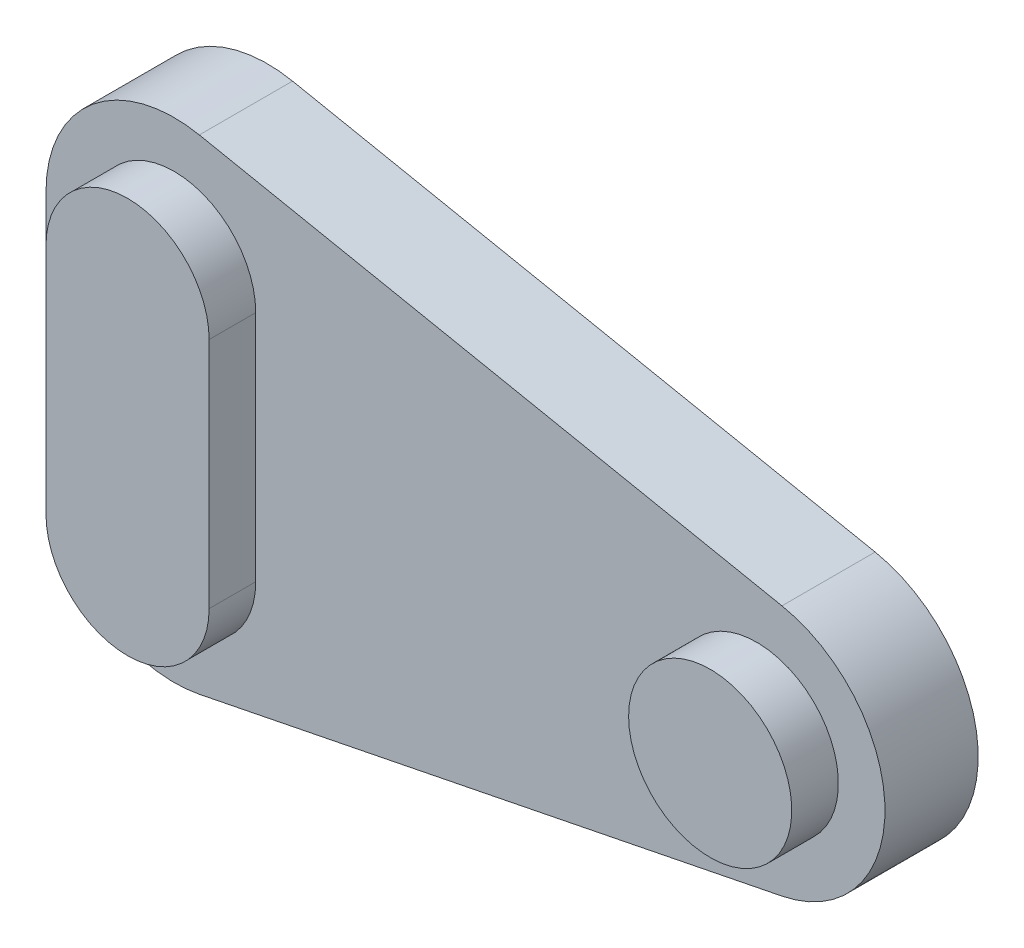
ISO-10303-21;
HEADER;
FILE_DESCRIPTION(('STEP AP214'),'2;1');
FILE_NAME('part.step','',(''),(''),'','','');
FILE_SCHEMA(('AUTOMOTIVE_DESIGN { 1 0 10303 214 1 1 1 1 }'));
ENDSEC;
DATA;
#1=APPLICATION_CONTEXT('core data for automotive mechanical design processes');
#2=APPLICATION_PROTOCOL_DEFINITION('international standard','automotive_design',2000,#1);
#3=PRODUCT_CONTEXT('',#1,'mechanical');
#4=PRODUCT('Part','Part','',(#3));
#5=PRODUCT_RELATED_PRODUCT_CATEGORY('part','',(#4));
#6=PRODUCT_DEFINITION_FORMATION('','',#4);
#7=PRODUCT_DEFINITION_CONTEXT('part definition',#1,'design');
#8=PRODUCT_DEFINITION('design','',#6,#7);
#9=PRODUCT_DEFINITION_SHAPE('','',#8);
#10=(LENGTH_UNIT() NAMED_UNIT(*) SI_UNIT(.MILLI.,.METRE.));
#11=(NAMED_UNIT(*) PLANE_ANGLE_UNIT() SI_UNIT($,.RADIAN.));
#12=(NAMED_UNIT(*) SI_UNIT($,.STERADIAN.) SOLID_ANGLE_UNIT());
#13=UNCERTAINTY_MEASURE_WITH_UNIT(LENGTH_MEASURE(1.E-05),#10,'distance_accuracy_value','');
#14=(GEOMETRIC_REPRESENTATION_CONTEXT(3) GLOBAL_UNCERTAINTY_ASSIGNED_CONTEXT((#13)) GLOBAL_UNIT_ASSIGNED_CONTEXT((#10,
#11,#12)) REPRESENTATION_CONTEXT('',''));
#15=CARTESIAN_POINT('',(0.,0.,0.));
#16=DIRECTION('',(0.,0.,1.));
#17=DIRECTION('',(1.,0.,0.));
#18=AXIS2_PLACEMENT_3D('',#15,#16,#17);
#19=CARTESIAN_POINT('',(0.,1.05170775148607E-06,5.08));
#20=DIRECTION('',(0.,0.,1.));
#21=DIRECTION('',(1.,0.,0.));
#22=AXIS2_PLACEMENT_3D('',#19,#20,#21);
#23=PLANE('',#22);
#24=DIRECTION('',(0.,1.,0.));
#25=VECTOR('',#24,1.);
#26=CARTESIAN_POINT('',(4.445,0.,5.08));
#27=LINE('',#26,#25);
#28=CARTESIAN_POINT('',(4.445,0.,5.08));
#29=VERTEX_POINT('',#28);
#30=CARTESIAN_POINT('',(4.445,12.7,5.08));
#31=VERTEX_POINT('',#30);
#32=EDGE_CURVE('E172',#29,#31,#27,.T.);
#33=ORIENTED_EDGE('',*,*,#32,.F.);
#34=CARTESIAN_POINT('',(0.,0.,5.08));
#35=DIRECTION('',(0.,0.,1.));
#36=DIRECTION('',(1.,0.,0.));
#37=AXIS2_PLACEMENT_3D('',#34,#35,#36);
#38=CIRCLE('',#37,4.445);
#39=CARTESIAN_POINT('',(-4.445,0.,5.08));
#40=VERTEX_POINT('',#39);
#41=EDGE_CURVE('E175',#40,#29,#38,.T.);
#42=ORIENTED_EDGE('',*,*,#41,.F.);
#43=DIRECTION('',(0.,-1.,0.));
#44=VECTOR('',#43,1.);
#45=CARTESIAN_POINT('',(-4.445,0.,5.08));
#46=LINE('',#45,#44);
#47=CARTESIAN_POINT('',(-4.445,12.7,5.08));
#48=VERTEX_POINT('',#47);
#49=EDGE_CURVE('E60',#48,#40,#46,.T.);
#50=ORIENTED_EDGE('',*,*,#49,.F.);
#51=CARTESIAN_POINT('',(0.,12.7,5.08));
#52=DIRECTION('',(0.,0.,1.));
#53=DIRECTION('',(1.,0.,0.));
#54=AXIS2_PLACEMENT_3D('',#51,#52,#53);
#55=CIRCLE('',#54,4.445);
#56=EDGE_CURVE('E170',#31,#48,#55,.T.);
#57=ORIENTED_EDGE('',*,*,#56,.F.);
#58=EDGE_LOOP('',(#33,#42,#50,#57));
#59=FACE_BOUND('',#58,.T.);
#60=CARTESIAN_POINT('',(0.,1.05170775148607E-06,5.08));
#61=DIRECTION('',(0.,0.,1.));
#62=DIRECTION('',(1.,0.,0.));
#63=AXIS2_PLACEMENT_3D('',#60,#61,#62);
#64=CIRCLE('',#63,6.985);
#65=CARTESIAN_POINT('',(-6.98499999999992,0.,5.08));
#66=VERTEX_POINT('',#65);
#67=CARTESIAN_POINT('',(1.36987098578392,-6.84935501162458,5.08));
#68=VERTEX_POINT('',#67);
#69=EDGE_CURVE('E152',#66,#68,#64,.T.);
#70=ORIENTED_EDGE('',*,*,#69,.T.);
#71=DIRECTION('',(0.980580681937342,0.196116103906073,0.));
#72=VECTOR('',#71,1.);
#73=CARTESIAN_POINT('',(1.36987098578392,-6.84935501162458,5.08));
#74=LINE('',#73,#72);
#75=CARTESIAN_POINT('',(33.1198709857839,-0.499356063332333,5.08));
#76=VERTEX_POINT('',#75);
#77=EDGE_CURVE('E104',#68,#76,#74,.T.);
#78=ORIENTED_EDGE('',*,*,#77,.T.);
#79=CARTESIAN_POINT('',(31.75,6.35,5.08));
#80=DIRECTION('',(0.,0.,1.));
#81=DIRECTION('',(1.,0.,0.));
#82=AXIS2_PLACEMENT_3D('',#79,#80,#81);
#83=CIRCLE('',#82,6.985);
#84=CARTESIAN_POINT('',(33.1198716084432,13.1993559388005,5.08));
#85=VERTEX_POINT('',#84);
#86=EDGE_CURVE('E120',#76,#85,#83,.T.);
#87=ORIENTED_EDGE('',*,*,#86,.T.);
#88=DIRECTION('',(-0.980580664108872,0.196116193048415,0.));
#89=VECTOR('',#88,1.);
#90=CARTESIAN_POINT('',(1.36987198345574,19.5493578138627,5.08));
#91=LINE('',#90,#89);
#92=CARTESIAN_POINT('',(1.36987198345574,19.5493578138627,5.08));
#93=VERTEX_POINT('',#92);
#94=EDGE_CURVE('E113',#85,#93,#91,.T.);
#95=ORIENTED_EDGE('',*,*,#94,.T.);
#96=CARTESIAN_POINT('',(0.,12.7,5.08));
#97=DIRECTION('',(0.,0.,1.));
#98=DIRECTION('',(1.,0.,0.));
#99=AXIS2_PLACEMENT_3D('',#96,#97,#98);
#100=CIRCLE('',#99,6.98500191219583);
#101=CARTESIAN_POINT('',(-6.98500191219583,12.7,5.08));
#102=VERTEX_POINT('',#101);
#103=EDGE_CURVE('E117',#93,#102,#100,.T.);
#104=ORIENTED_EDGE('',*,*,#103,.T.);
#105=DIRECTION('',(1.50566607246408E-07,-0.999999999999989,0.));
#106=VECTOR('',#105,1.);
#107=CARTESIAN_POINT('',(-6.98499999999992,0.,5.08));
#108=LINE('',#107,#106);
#109=EDGE_CURVE('E69',#102,#66,#108,.T.);
#110=ORIENTED_EDGE('',*,*,#109,.T.);
#111=EDGE_LOOP('',(#70,#78,#87,#95,#104,#110));
#112=FACE_BOUND('',#111,.T.);
#113=CARTESIAN_POINT('',(31.75,6.35,5.08));
#114=DIRECTION('',(0.,0.,1.));
#115=DIRECTION('',(1.,0.,0.));
#116=AXIS2_PLACEMENT_3D('',#113,#114,#115);
#117=CIRCLE('',#116,4.445);
#118=CARTESIAN_POINT('',(27.305,6.35,5.08));
#119=VERTEX_POINT('',#118);
#120=EDGE_CURVE('E178',#119,#119,#117,.T.);
#121=ORIENTED_EDGE('',*,*,#120,.F.);
#122=EDGE_LOOP('',(#121));
#123=FACE_BOUND('',#122,.T.);
#124=ADVANCED_FACE('F45',(#59,#112,#123),#23,.T.);
#125=CARTESIAN_POINT('',(0.,1.05170775148607E-06,0.));
#126=DIRECTION('',(0.,0.,1.));
#127=DIRECTION('',(1.,0.,0.));
#128=AXIS2_PLACEMENT_3D('',#125,#126,#127);
#129=PLANE('',#128);
#130=CARTESIAN_POINT('',(0.,1.05170775148607E-06,0.));
#131=DIRECTION('',(0.,0.,1.));
#132=DIRECTION('',(1.,0.,0.));
#133=AXIS2_PLACEMENT_3D('',#130,#131,#132);
#134=CIRCLE('',#133,6.985);
#135=CARTESIAN_POINT('',(-6.98499999999992,0.,0.));
#136=VERTEX_POINT('',#135);
#137=CARTESIAN_POINT('',(1.36987098578392,-6.84935501162458,0.));
#138=VERTEX_POINT('',#137);
#139=EDGE_CURVE('E141',#136,#138,#134,.T.);
#140=ORIENTED_EDGE('',*,*,#139,.F.);
#141=DIRECTION('',(1.50566607246408E-07,-0.999999999999989,0.));
#142=VECTOR('',#141,1.);
#143=CARTESIAN_POINT('',(-6.98499999999992,0.,0.));
#144=LINE('',#143,#142);
#145=CARTESIAN_POINT('',(-6.98500191219583,12.7,0.));
#146=VERTEX_POINT('',#145);
#147=EDGE_CURVE('E96',#146,#136,#144,.T.);
#148=ORIENTED_EDGE('',*,*,#147,.F.);
#149=CARTESIAN_POINT('',(0.,12.7,0.));
#150=DIRECTION('',(0.,0.,1.));
#151=DIRECTION('',(1.,0.,0.));
#152=AXIS2_PLACEMENT_3D('',#149,#150,#151);
#153=CIRCLE('',#152,6.98500191219583);
#154=CARTESIAN_POINT('',(1.36987198345574,19.5493578138627,0.));
#155=VERTEX_POINT('',#154);
#156=EDGE_CURVE('E149',#155,#146,#153,.T.);
#157=ORIENTED_EDGE('',*,*,#156,.F.);
#158=DIRECTION('',(-0.980580664108872,0.196116193048415,0.));
#159=VECTOR('',#158,1.);
#160=CARTESIAN_POINT('',(1.36987198345574,19.5493578138627,0.));
#161=LINE('',#160,#159);
#162=CARTESIAN_POINT('',(33.1198716084432,13.1993559388005,0.));
#163=VERTEX_POINT('',#162);
#164=EDGE_CURVE('E129',#163,#155,#161,.T.);
#165=ORIENTED_EDGE('',*,*,#164,.F.);
#166=CARTESIAN_POINT('',(31.75,6.35,0.));
#167=DIRECTION('',(0.,0.,1.));
#168=DIRECTION('',(1.,0.,0.));
#169=AXIS2_PLACEMENT_3D('',#166,#167,#168);
#170=CIRCLE('',#169,6.985);
#171=CARTESIAN_POINT('',(33.1198709857839,-0.499356063332333,0.));
#172=VERTEX_POINT('',#171);
#173=EDGE_CURVE('E146',#172,#163,#170,.T.);
#174=ORIENTED_EDGE('',*,*,#173,.F.);
#175=DIRECTION('',(0.980580681937342,0.196116103906073,0.));
#176=VECTOR('',#175,1.);
#177=CARTESIAN_POINT('',(1.36987098578392,-6.84935501162458,0.));
#178=LINE('',#177,#176);
#179=EDGE_CURVE('E144',#138,#172,#178,.T.);
#180=ORIENTED_EDGE('',*,*,#179,.F.);
#181=EDGE_LOOP('',(#140,#148,#157,#165,#174,#180));
#182=FACE_BOUND('',#181,.T.);
#183=ADVANCED_FACE('F161',(#182),#129,.F.);
#184=CARTESIAN_POINT('',(0.,1.05170775148607E-06,5.08));
#185=DIRECTION('',(0.,0.,-1.));
#186=DIRECTION('',(-1.,0.,0.));
#187=AXIS2_PLACEMENT_3D('',#184,#185,#186);
#188=CYLINDRICAL_SURFACE('',#187,6.985);
#189=ORIENTED_EDGE('',*,*,#139,.T.);
#190=DIRECTION('',(0.,0.,-1.));
#191=VECTOR('',#190,1.);
#192=CARTESIAN_POINT('',(1.36987098578392,-6.84935501162458,5.08));
#193=LINE('',#192,#191);
#194=EDGE_CURVE('E11',#68,#138,#193,.T.);
#195=ORIENTED_EDGE('',*,*,#194,.F.);
#196=ORIENTED_EDGE('',*,*,#69,.F.);
#197=DIRECTION('',(0.,0.,-1.));
#198=VECTOR('',#197,1.);
#199=CARTESIAN_POINT('',(-6.98499999999992,0.,5.08));
#200=LINE('',#199,#198);
#201=EDGE_CURVE('E137',#66,#136,#200,.T.);
#202=ORIENTED_EDGE('',*,*,#201,.T.);
#203=EDGE_LOOP('',(#189,#195,#196,#202));
#204=FACE_BOUND('',#203,.T.);
#205=ADVANCED_FACE('F47',(#204),#188,.T.);
#206=CARTESIAN_POINT('',(1.36987098578392,-6.84935501162458,5.08));
#207=DIRECTION('',(-0.196116103906073,0.980580681937342,0.));
#208=DIRECTION('',(-0.980580681937342,-0.196116103906073,0.));
#209=AXIS2_PLACEMENT_3D('',#206,#207,#208);
#210=PLANE('',#209);
#211=ORIENTED_EDGE('',*,*,#179,.T.);
#212=DIRECTION('',(0.,0.,-1.));
#213=VECTOR('',#212,1.);
#214=CARTESIAN_POINT('',(33.1198709857839,-0.499356063332333,5.08));
#215=LINE('',#214,#213);
#216=EDGE_CURVE('E53',#76,#172,#215,.T.);
#217=ORIENTED_EDGE('',*,*,#216,.F.);
#218=ORIENTED_EDGE('',*,*,#77,.F.);
#219=ORIENTED_EDGE('',*,*,#194,.T.);
#220=EDGE_LOOP('',(#211,#217,#218,#219));
#221=FACE_BOUND('',#220,.T.);
#222=ADVANCED_FACE('F242',(#221),#210,.F.);
#223=CARTESIAN_POINT('',(31.75,6.35,5.08));
#224=DIRECTION('',(0.,0.,-1.));
#225=DIRECTION('',(-1.,0.,0.));
#226=AXIS2_PLACEMENT_3D('',#223,#224,#225);
#227=CYLINDRICAL_SURFACE('',#226,6.985);
#228=ORIENTED_EDGE('',*,*,#173,.T.);
#229=DIRECTION('',(0.,0.,-1.));
#230=VECTOR('',#229,1.);
#231=CARTESIAN_POINT('',(33.1198716084432,13.1993559388005,5.08));
#232=LINE('',#231,#230);
#233=EDGE_CURVE('E132',#85,#163,#232,.T.);
#234=ORIENTED_EDGE('',*,*,#233,.F.);
#235=ORIENTED_EDGE('',*,*,#86,.F.);
#236=ORIENTED_EDGE('',*,*,#216,.T.);
#237=EDGE_LOOP('',(#228,#234,#235,#236));
#238=FACE_BOUND('',#237,.T.);
#239=ADVANCED_FACE('F158',(#238),#227,.T.);
#240=CARTESIAN_POINT('',(1.36987198345574,19.5493578138627,5.08));
#241=DIRECTION('',(-0.196116193048415,-0.980580664108872,0.));
#242=DIRECTION('',(0.980580664108872,-0.196116193048415,0.));
#243=AXIS2_PLACEMENT_3D('',#240,#241,#242);
#244=PLANE('',#243);
#245=ORIENTED_EDGE('',*,*,#164,.T.);
#246=DIRECTION('',(0.,0.,-1.));
#247=VECTOR('',#246,1.);
#248=CARTESIAN_POINT('',(1.36987198345574,19.5493578138627,5.08));
#249=LINE('',#248,#247);
#250=EDGE_CURVE('E126',#93,#155,#249,.T.);
#251=ORIENTED_EDGE('',*,*,#250,.F.);
#252=ORIENTED_EDGE('',*,*,#94,.F.);
#253=ORIENTED_EDGE('',*,*,#233,.T.);
#254=EDGE_LOOP('',(#245,#251,#252,#253));
#255=FACE_BOUND('',#254,.T.);
#256=ADVANCED_FACE('F127',(#255),#244,.F.);
#257=CARTESIAN_POINT('',(0.,12.7,5.08));
#258=DIRECTION('',(0.,0.,-1.));
#259=DIRECTION('',(-1.,0.,0.));
#260=AXIS2_PLACEMENT_3D('',#257,#258,#259);
#261=CYLINDRICAL_SURFACE('',#260,6.98500191219583);
#262=ORIENTED_EDGE('',*,*,#156,.T.);
#263=DIRECTION('',(0.,0.,-1.));
#264=VECTOR('',#263,1.);
#265=CARTESIAN_POINT('',(-6.98500191219583,12.7,5.08));
#266=LINE('',#265,#264);
#267=EDGE_CURVE('E133',#102,#146,#266,.T.);
#268=ORIENTED_EDGE('',*,*,#267,.F.);
#269=ORIENTED_EDGE('',*,*,#103,.F.);
#270=ORIENTED_EDGE('',*,*,#250,.T.);
#271=EDGE_LOOP('',(#262,#268,#269,#270));
#272=FACE_BOUND('',#271,.T.);
#273=ADVANCED_FACE('F135',(#272),#261,.T.);
#274=CARTESIAN_POINT('',(-6.98499999999992,0.,5.08));
#275=DIRECTION('',(0.999999999999989,1.50566607246408E-07,0.));
#276=DIRECTION('',(-1.50566607246408E-07,0.999999999999989,0.));
#277=AXIS2_PLACEMENT_3D('',#274,#275,#276);
#278=PLANE('',#277);
#279=ORIENTED_EDGE('',*,*,#147,.T.);
#280=ORIENTED_EDGE('',*,*,#201,.F.);
#281=ORIENTED_EDGE('',*,*,#109,.F.);
#282=ORIENTED_EDGE('',*,*,#267,.T.);
#283=EDGE_LOOP('',(#279,#280,#281,#282));
#284=FACE_BOUND('',#283,.T.);
#285=ADVANCED_FACE('F162',(#284),#278,.F.);
#286=CARTESIAN_POINT('',(4.445,0.,7.62));
#287=DIRECTION('',(-1.,0.,0.));
#288=DIRECTION('',(0.,0.,1.));
#289=AXIS2_PLACEMENT_3D('',#286,#287,#288);
#290=PLANE('',#289);
#291=ORIENTED_EDGE('',*,*,#32,.T.);
#292=DIRECTION('',(0.,0.,-1.));
#293=VECTOR('',#292,1.);
#294=CARTESIAN_POINT('',(4.445,12.7,7.62));
#295=LINE('',#294,#293);
#296=CARTESIAN_POINT('',(4.445,12.7,7.62));
#297=VERTEX_POINT('',#296);
#298=EDGE_CURVE('E181',#297,#31,#295,.T.);
#299=ORIENTED_EDGE('',*,*,#298,.F.);
#300=DIRECTION('',(0.,1.,0.));
#301=VECTOR('',#300,1.);
#302=CARTESIAN_POINT('',(4.445,0.,7.62));
#303=LINE('',#302,#301);
#304=CARTESIAN_POINT('',(4.445,0.,7.62));
#305=VERTEX_POINT('',#304);
#306=EDGE_CURVE('E202',#305,#297,#303,.T.);
#307=ORIENTED_EDGE('',*,*,#306,.F.);
#308=DIRECTION('',(0.,0.,-1.));
#309=VECTOR('',#308,1.);
#310=CARTESIAN_POINT('',(4.445,0.,7.62));
#311=LINE('',#310,#309);
#312=EDGE_CURVE('E190',#305,#29,#311,.T.);
#313=ORIENTED_EDGE('',*,*,#312,.T.);
#314=EDGE_LOOP('',(#291,#299,#307,#313));
#315=FACE_BOUND('',#314,.T.);
#316=ADVANCED_FACE('F232',(#315),#290,.F.);
#317=CARTESIAN_POINT('',(0.,12.7,7.62));
#318=DIRECTION('',(0.,0.,-1.));
#319=DIRECTION('',(-1.,0.,0.));
#320=AXIS2_PLACEMENT_3D('',#317,#318,#319);
#321=CYLINDRICAL_SURFACE('',#320,4.445);
#322=ORIENTED_EDGE('',*,*,#56,.T.);
#323=DIRECTION('',(0.,0.,-1.));
#324=VECTOR('',#323,1.);
#325=CARTESIAN_POINT('',(-4.445,12.7,7.62));
#326=LINE('',#325,#324);
#327=CARTESIAN_POINT('',(-4.445,12.7,7.62));
#328=VERTEX_POINT('',#327);
#329=EDGE_CURVE('E184',#328,#48,#326,.T.);
#330=ORIENTED_EDGE('',*,*,#329,.F.);
#331=CARTESIAN_POINT('',(0.,12.7,7.62));
#332=DIRECTION('',(0.,0.,1.));
#333=DIRECTION('',(1.,0.,0.));
#334=AXIS2_PLACEMENT_3D('',#331,#332,#333);
#335=CIRCLE('',#334,4.445);
#336=EDGE_CURVE('E199',#297,#328,#335,.T.);
#337=ORIENTED_EDGE('',*,*,#336,.F.);
#338=ORIENTED_EDGE('',*,*,#298,.T.);
#339=EDGE_LOOP('',(#322,#330,#337,#338));
#340=FACE_BOUND('',#339,.T.);
#341=ADVANCED_FACE('F327',(#340),#321,.T.);
#342=CARTESIAN_POINT('',(-4.445,0.,7.62));
#343=DIRECTION('',(-1.,0.,0.));
#344=DIRECTION('',(0.,0.,1.));
#345=AXIS2_PLACEMENT_3D('',#342,#343,#344);
#346=PLANE('',#345);
#347=ORIENTED_EDGE('',*,*,#329,.T.);
#348=ORIENTED_EDGE('',*,*,#49,.T.);
#349=DIRECTION('',(0.,0.,-1.));
#350=VECTOR('',#349,1.);
#351=CARTESIAN_POINT('',(-4.445,0.,7.62));
#352=LINE('',#351,#350);
#353=CARTESIAN_POINT('',(-4.445,0.,7.62));
#354=VERTEX_POINT('',#353);
#355=EDGE_CURVE('E187',#354,#40,#352,.T.);
#356=ORIENTED_EDGE('',*,*,#355,.F.);
#357=DIRECTION('',(0.,1.,0.));
#358=VECTOR('',#357,1.);
#359=CARTESIAN_POINT('',(-4.445,0.,7.62));
#360=LINE('',#359,#358);
#361=EDGE_CURVE('E196',#354,#328,#360,.T.);
#362=ORIENTED_EDGE('',*,*,#361,.T.);
#363=EDGE_LOOP('',(#347,#348,#356,#362));
#364=FACE_BOUND('',#363,.T.);
#365=ADVANCED_FACE('F337',(#364),#346,.T.);
#366=CARTESIAN_POINT('',(0.,0.,7.62));
#367=DIRECTION('',(0.,0.,-1.));
#368=DIRECTION('',(-1.,0.,0.));
#369=AXIS2_PLACEMENT_3D('',#366,#367,#368);
#370=CYLINDRICAL_SURFACE('',#369,4.445);
#371=ORIENTED_EDGE('',*,*,#41,.T.);
#372=ORIENTED_EDGE('',*,*,#312,.F.);
#373=CARTESIAN_POINT('',(0.,0.,7.62));
#374=DIRECTION('',(0.,0.,1.));
#375=DIRECTION('',(1.,0.,0.));
#376=AXIS2_PLACEMENT_3D('',#373,#374,#375);
#377=CIRCLE('',#376,4.445);
#378=EDGE_CURVE('E193',#354,#305,#377,.T.);
#379=ORIENTED_EDGE('',*,*,#378,.F.);
#380=ORIENTED_EDGE('',*,*,#355,.T.);
#381=EDGE_LOOP('',(#371,#372,#379,#380));
#382=FACE_BOUND('',#381,.T.);
#383=ADVANCED_FACE('F221',(#382),#370,.T.);
#384=CARTESIAN_POINT('',(0.,0.,7.62));
#385=DIRECTION('',(0.,0.,1.));
#386=DIRECTION('',(1.,0.,0.));
#387=AXIS2_PLACEMENT_3D('',#384,#385,#386);
#388=PLANE('',#387);
#389=ORIENTED_EDGE('',*,*,#306,.T.);
#390=ORIENTED_EDGE('',*,*,#336,.T.);
#391=ORIENTED_EDGE('',*,*,#361,.F.);
#392=ORIENTED_EDGE('',*,*,#378,.T.);
#393=EDGE_LOOP('',(#389,#390,#391,#392));
#394=FACE_BOUND('',#393,.T.);
#395=ADVANCED_FACE('F213',(#394),#388,.T.);
#396=CARTESIAN_POINT('',(31.75,6.35,7.62));
#397=DIRECTION('',(0.,0.,-1.));
#398=DIRECTION('',(-1.,0.,0.));
#399=AXIS2_PLACEMENT_3D('',#396,#397,#398);
#400=CYLINDRICAL_SURFACE('',#399,4.445);
#401=CARTESIAN_POINT('',(31.75,6.35,7.62));
#402=DIRECTION('',(0.,0.,1.));
#403=DIRECTION('',(1.,0.,0.));
#404=AXIS2_PLACEMENT_3D('',#401,#402,#403);
#405=CIRCLE('',#404,4.445);
#406=CARTESIAN_POINT('',(27.305,6.35,7.62));
#407=VERTEX_POINT('',#406);
#408=EDGE_CURVE('E205',#407,#407,#405,.T.);
#409=CARTESIAN_POINT('',(27.305,6.35,5.08));
#410=CARTESIAN_POINT('',(27.305,6.35,5.10645833333333));
#411=CARTESIAN_POINT('',(27.305,6.35,5.13291666666667));
#412=CARTESIAN_POINT('',(27.305,6.35,5.18583333333333));
#413=CARTESIAN_POINT('',(27.305,6.35,5.21229166666667));
#414=CARTESIAN_POINT('',(27.305,6.35,5.26520833333333));
#415=CARTESIAN_POINT('',(27.305,6.35,5.29166666666667));
#416=CARTESIAN_POINT('',(27.305,6.35,5.34458333333333));
#417=CARTESIAN_POINT('',(27.305,6.35,5.37104166666667));
#418=CARTESIAN_POINT('',(27.305,6.35,5.42395833333333));
#419=CARTESIAN_POINT('',(27.305,6.35,5.45041666666667));
#420=CARTESIAN_POINT('',(27.305,6.35,5.50333333333333));
#421=CARTESIAN_POINT('',(27.305,6.35,5.52979166666667));
#422=CARTESIAN_POINT('',(27.305,6.35,5.58270833333333));
#423=CARTESIAN_POINT('',(27.305,6.35,5.60916666666667));
#424=CARTESIAN_POINT('',(27.305,6.35,5.66208333333333));
#425=CARTESIAN_POINT('',(27.305,6.35,5.68854166666667));
#426=CARTESIAN_POINT('',(27.305,6.35,5.74145833333333));
#427=CARTESIAN_POINT('',(27.305,6.35,5.76791666666667));
#428=CARTESIAN_POINT('',(27.305,6.35,5.82083333333333));
#429=CARTESIAN_POINT('',(27.305,6.35,5.84729166666667));
#430=CARTESIAN_POINT('',(27.305,6.35,5.90020833333333));
#431=CARTESIAN_POINT('',(27.305,6.35,5.92666666666667));
#432=CARTESIAN_POINT('',(27.305,6.35,5.97958333333333));
#433=CARTESIAN_POINT('',(27.305,6.35,6.00604166666667));
#434=CARTESIAN_POINT('',(27.305,6.35,6.05895833333333));
#435=CARTESIAN_POINT('',(27.305,6.35,6.08541666666667));
#436=CARTESIAN_POINT('',(27.305,6.35,6.13833333333333));
#437=CARTESIAN_POINT('',(27.305,6.35,6.16479166666667));
#438=CARTESIAN_POINT('',(27.305,6.35,6.21770833333333));
#439=CARTESIAN_POINT('',(27.305,6.35,6.24416666666667));
#440=CARTESIAN_POINT('',(27.305,6.35,6.29708333333333));
#441=CARTESIAN_POINT('',(27.305,6.35,6.32354166666667));
#442=CARTESIAN_POINT('',(27.305,6.35,6.37645833333333));
#443=CARTESIAN_POINT('',(27.305,6.35,6.40291666666667));
#444=CARTESIAN_POINT('',(27.305,6.35,6.45583333333333));
#445=CARTESIAN_POINT('',(27.305,6.35,6.48229166666667));
#446=CARTESIAN_POINT('',(27.305,6.35,6.53520833333333));
#447=CARTESIAN_POINT('',(27.305,6.35,6.56166666666667));
#448=CARTESIAN_POINT('',(27.305,6.35,6.61458333333333));
#449=CARTESIAN_POINT('',(27.305,6.35,6.64104166666667));
#450=CARTESIAN_POINT('',(27.305,6.35,6.69395833333333));
#451=CARTESIAN_POINT('',(27.305,6.35,6.72041666666667));
#452=CARTESIAN_POINT('',(27.305,6.35,6.77333333333333));
#453=CARTESIAN_POINT('',(27.305,6.35,6.79979166666667));
#454=CARTESIAN_POINT('',(27.305,6.35,6.85270833333333));
#455=CARTESIAN_POINT('',(27.305,6.35,6.87916666666667));
#456=CARTESIAN_POINT('',(27.305,6.35,6.93208333333333));
#457=CARTESIAN_POINT('',(27.305,6.35,6.95854166666667));
#458=CARTESIAN_POINT('',(27.305,6.35,7.01145833333333));
#459=CARTESIAN_POINT('',(27.305,6.35,7.03791666666667));
#460=CARTESIAN_POINT('',(27.305,6.35,7.09083333333333));
#461=CARTESIAN_POINT('',(27.305,6.35,7.11729166666667));
#462=CARTESIAN_POINT('',(27.305,6.35,7.17020833333333));
#463=CARTESIAN_POINT('',(27.305,6.35,7.19666666666667));
#464=CARTESIAN_POINT('',(27.305,6.35,7.24958333333333));
#465=CARTESIAN_POINT('',(27.305,6.35,7.27604166666667));
#466=CARTESIAN_POINT('',(27.305,6.35,7.32895833333333));
#467=CARTESIAN_POINT('',(27.305,6.35,7.35541666666667));
#468=CARTESIAN_POINT('',(27.305,6.35,7.40833333333333));
#469=CARTESIAN_POINT('',(27.305,6.35,7.43479166666667));
#470=CARTESIAN_POINT('',(27.305,6.35,7.48770833333333));
#471=CARTESIAN_POINT('',(27.305,6.35,7.51416666666667));
#472=CARTESIAN_POINT('',(27.305,6.35,7.56708333333333));
#473=CARTESIAN_POINT('',(27.305,6.35,7.59354166666667));
#474=CARTESIAN_POINT('',(27.305,6.35,7.62));
#475=B_SPLINE_CURVE_WITH_KNOTS('',3,(#409,#410,#411,#412,#413,#414,#415,#416,#417,#418,#419,
#420,#421,#422,#423,#424,#425,#426,#427,#428,#429,#430,#431,#432,#433,#434,#435,#436,#437,#438,
#439,#440,#441,#442,#443,#444,#445,#446,#447,#448,#449,#450,#451,#452,#453,#454,#455,#456,#457,
#458,#459,#460,#461,#462,#463,#464,#465,#466,#467,#468,#469,#470,#471,#472,#473,#474),
.UNSPECIFIED.,.F.,.F.,(4,2,2,2,2,2,2,2,2,2,2,2,2,2,2,2,2,2,2,2,2,2,2,2,2,2,2,2,2,2,2,2,4),(0.,
0.0793750000000004,0.158750000000001,0.238125,0.3175,0.396875,0.476250000000001,
0.555625000000001,0.635,0.714375,0.79375,0.873125,0.9525,1.031875,1.11125,1.190625,1.27,
1.349375,1.42875,1.508125,1.5875,1.666875,1.74625,1.825625,1.905,1.984375,2.06375,2.143125,
2.2225,2.301875,2.38125,2.460625,2.54),.UNSPECIFIED.);
#476=EDGE_CURVE('BSEAM211',#119,#407,#475,.T.);
#477=ORIENTED_EDGE('',*,*,#120,.T.);
#478=ORIENTED_EDGE('',*,*,#408,.F.);
#479=ORIENTED_EDGE('',*,*,#476,.T.);
#480=ORIENTED_EDGE('',*,*,#476,.F.);
#481=EDGE_LOOP('',(#477,#479,#478,#480));
#482=FACE_BOUND('',#481,.T.);
#483=ADVANCED_FACE('F211',(#482),#400,.T.);
#484=CARTESIAN_POINT('',(0.,0.,7.62));
#485=DIRECTION('',(0.,0.,1.));
#486=DIRECTION('',(1.,0.,0.));
#487=AXIS2_PLACEMENT_3D('',#484,#485,#486);
#488=PLANE('',#487);
#489=ORIENTED_EDGE('',*,*,#408,.T.);
#490=EDGE_LOOP('',(#489));
#491=FACE_BOUND('',#490,.T.);
#492=ADVANCED_FACE('F209',(#491),#488,.T.);
#493=CLOSED_SHELL('',(#124,#183,#205,#222,#239,#256,#273,#285,#316,#341,#365,#383,#395,#483,#492));
#494=MANIFOLD_SOLID_BREP('B2',#493);
#495=ADVANCED_BREP_SHAPE_REPRESENTATION('',(#18,#494),#14);
#496=SHAPE_DEFINITION_REPRESENTATION(#9,#495);
ENDSEC;
END-ISO-10303-21;
